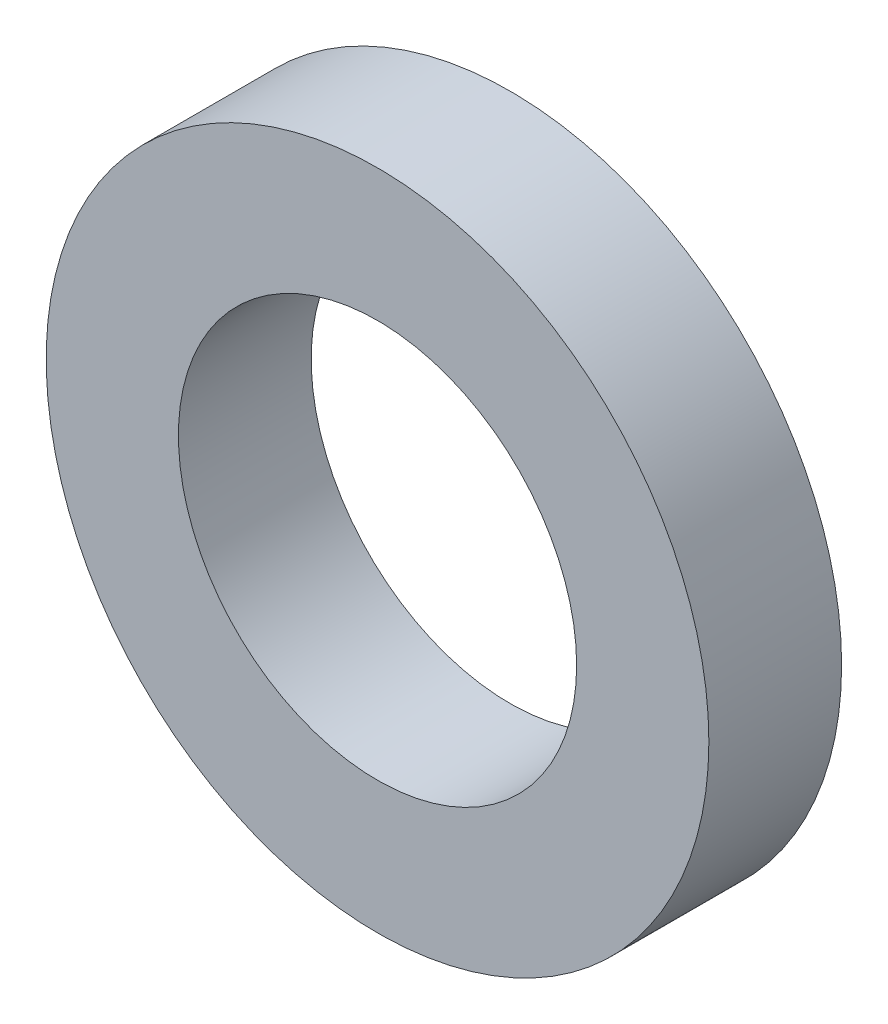
ISO-10303-21;
HEADER;
FILE_DESCRIPTION(('STEP AP214'),'2;1');
FILE_NAME('part.step','',(''),(''),'','','');
FILE_SCHEMA(('AUTOMOTIVE_DESIGN { 1 0 10303 214 1 1 1 1 }'));
ENDSEC;
DATA;
#1=APPLICATION_CONTEXT('core data for automotive mechanical design processes');
#2=APPLICATION_PROTOCOL_DEFINITION('international standard','automotive_design',2000,#1);
#3=PRODUCT_CONTEXT('',#1,'mechanical');
#4=PRODUCT('Part','Part','',(#3));
#5=PRODUCT_RELATED_PRODUCT_CATEGORY('part','',(#4));
#6=PRODUCT_DEFINITION_FORMATION('','',#4);
#7=PRODUCT_DEFINITION_CONTEXT('part definition',#1,'design');
#8=PRODUCT_DEFINITION('design','',#6,#7);
#9=PRODUCT_DEFINITION_SHAPE('','',#8);
#10=(LENGTH_UNIT() NAMED_UNIT(*) SI_UNIT(.MILLI.,.METRE.));
#11=(NAMED_UNIT(*) PLANE_ANGLE_UNIT() SI_UNIT($,.RADIAN.));
#12=(NAMED_UNIT(*) SI_UNIT($,.STERADIAN.) SOLID_ANGLE_UNIT());
#13=UNCERTAINTY_MEASURE_WITH_UNIT(LENGTH_MEASURE(1.E-05),#10,'distance_accuracy_value','');
#14=(GEOMETRIC_REPRESENTATION_CONTEXT(3) GLOBAL_UNCERTAINTY_ASSIGNED_CONTEXT((#13)) GLOBAL_UNIT_ASSIGNED_CONTEXT((#10,
#11,#12)) REPRESENTATION_CONTEXT('',''));
#15=CARTESIAN_POINT('',(0.,0.,0.));
#16=DIRECTION('',(0.,0.,1.));
#17=DIRECTION('',(1.,0.,0.));
#18=AXIS2_PLACEMENT_3D('',#15,#16,#17);
#19=CARTESIAN_POINT('',(0.,0.,1.5875));
#20=DIRECTION('',(0.,0.,1.));
#21=DIRECTION('',(1.,0.,0.));
#22=AXIS2_PLACEMENT_3D('',#19,#20,#21);
#23=PLANE('',#22);
#24=CARTESIAN_POINT('',(0.,0.,1.5875));
#25=DIRECTION('',(0.,0.,1.));
#26=DIRECTION('',(1.,0.,0.));
#27=AXIS2_PLACEMENT_3D('',#24,#25,#26);
#28=CIRCLE('',#27,3.9624);
#29=CARTESIAN_POINT('',(3.9624,0.,1.5875));
#30=VERTEX_POINT('',#29);
#31=EDGE_CURVE('E10',#30,#30,#28,.T.);
#32=ORIENTED_EDGE('',*,*,#31,.T.);
#33=EDGE_LOOP('',(#32));
#34=FACE_BOUND('',#33,.T.);
#35=CARTESIAN_POINT('',(0.,0.,1.5875));
#36=DIRECTION('',(0.,0.,1.));
#37=DIRECTION('',(1.,0.,0.));
#38=AXIS2_PLACEMENT_3D('',#35,#36,#37);
#39=CIRCLE('',#38,2.38125);
#40=CARTESIAN_POINT('',(2.38125,0.,1.5875));
#41=VERTEX_POINT('',#40);
#42=EDGE_CURVE('E50',#41,#41,#39,.T.);
#43=ORIENTED_EDGE('',*,*,#42,.F.);
#44=EDGE_LOOP('',(#43));
#45=FACE_BOUND('',#44,.T.);
#46=ADVANCED_FACE('F37',(#34,#45),#23,.T.);
#47=CARTESIAN_POINT('',(0.,0.,0.));
#48=DIRECTION('',(0.,0.,1.));
#49=DIRECTION('',(1.,0.,0.));
#50=AXIS2_PLACEMENT_3D('',#47,#48,#49);
#51=PLANE('',#50);
#52=CARTESIAN_POINT('',(0.,0.,0.));
#53=DIRECTION('',(0.,0.,1.));
#54=DIRECTION('',(1.,0.,0.));
#55=AXIS2_PLACEMENT_3D('',#52,#53,#54);
#56=CIRCLE('',#55,3.9624);
#57=CARTESIAN_POINT('',(3.9624,0.,0.));
#58=VERTEX_POINT('',#57);
#59=EDGE_CURVE('E41',#58,#58,#56,.T.);
#60=ORIENTED_EDGE('',*,*,#59,.F.);
#61=EDGE_LOOP('',(#60));
#62=FACE_BOUND('',#61,.T.);
#63=CARTESIAN_POINT('',(0.,0.,0.));
#64=DIRECTION('',(0.,0.,1.));
#65=DIRECTION('',(1.,0.,0.));
#66=AXIS2_PLACEMENT_3D('',#63,#64,#65);
#67=CIRCLE('',#66,2.38125);
#68=CARTESIAN_POINT('',(2.38125,0.,0.));
#69=VERTEX_POINT('',#68);
#70=EDGE_CURVE('E52',#69,#69,#67,.T.);
#71=ORIENTED_EDGE('',*,*,#70,.T.);
#72=EDGE_LOOP('',(#71));
#73=FACE_BOUND('',#72,.T.);
#74=ADVANCED_FACE('F64',(#62,#73),#51,.F.);
#75=CARTESIAN_POINT('',(0.,0.,1.5875));
#76=DIRECTION('',(0.,0.,-1.));
#77=DIRECTION('',(-1.,0.,0.));
#78=AXIS2_PLACEMENT_3D('',#75,#76,#77);
#79=CYLINDRICAL_SURFACE('',#78,3.9624);
#80=ORIENTED_EDGE('',*,*,#31,.F.);
#81=EDGE_LOOP('',(#80));
#82=FACE_BOUND('',#81,.T.);
#83=ORIENTED_EDGE('',*,*,#59,.T.);
#84=EDGE_LOOP('',(#83));
#85=FACE_BOUND('',#84,.T.);
#86=ADVANCED_FACE('F39',(#82,#85),#79,.T.);
#87=CARTESIAN_POINT('',(0.,0.,1.5875));
#88=DIRECTION('',(0.,0.,-1.));
#89=DIRECTION('',(-1.,0.,0.));
#90=AXIS2_PLACEMENT_3D('',#87,#88,#89);
#91=CYLINDRICAL_SURFACE('',#90,2.38125);
#92=ORIENTED_EDGE('',*,*,#42,.T.);
#93=EDGE_LOOP('',(#92));
#94=FACE_BOUND('',#93,.T.);
#95=ORIENTED_EDGE('',*,*,#70,.F.);
#96=EDGE_LOOP('',(#95));
#97=FACE_BOUND('',#96,.T.);
#98=ADVANCED_FACE('F60',(#94,#97),#91,.F.);
#99=CLOSED_SHELL('',(#46,#74,#86,#98));
#100=MANIFOLD_SOLID_BREP('B2',#99);
#101=ADVANCED_BREP_SHAPE_REPRESENTATION('',(#18,#100),#14);
#102=SHAPE_DEFINITION_REPRESENTATION(#9,#101);
ENDSEC;
END-ISO-10303-21;
